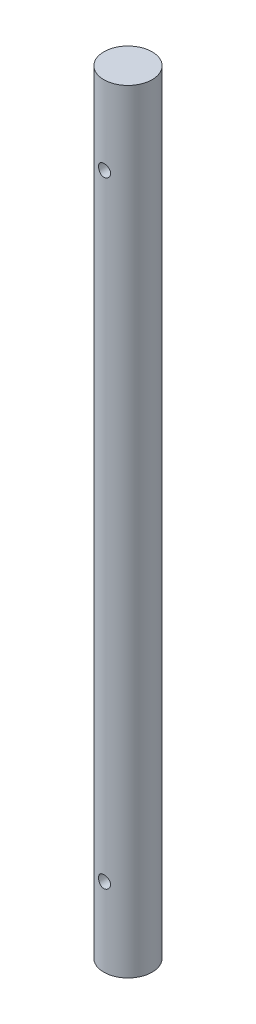
ISO-10303-21;
HEADER;
FILE_DESCRIPTION(('STEP AP214'),'2;1');
FILE_NAME('part.step','',(''),(''),'','','');
FILE_SCHEMA(('AUTOMOTIVE_DESIGN { 1 0 10303 214 1 1 1 1 }'));
ENDSEC;
DATA;
#1=APPLICATION_CONTEXT('core data for automotive mechanical design processes');
#2=APPLICATION_PROTOCOL_DEFINITION('international standard','automotive_design',2000,#1);
#3=PRODUCT_CONTEXT('',#1,'mechanical');
#4=PRODUCT('Part','Part','',(#3));
#5=PRODUCT_RELATED_PRODUCT_CATEGORY('part','',(#4));
#6=PRODUCT_DEFINITION_FORMATION('','',#4);
#7=PRODUCT_DEFINITION_CONTEXT('part definition',#1,'design');
#8=PRODUCT_DEFINITION('design','',#6,#7);
#9=PRODUCT_DEFINITION_SHAPE('','',#8);
#10=(LENGTH_UNIT() NAMED_UNIT(*) SI_UNIT(.MILLI.,.METRE.));
#11=(NAMED_UNIT(*) PLANE_ANGLE_UNIT() SI_UNIT($,.RADIAN.));
#12=(NAMED_UNIT(*) SI_UNIT($,.STERADIAN.) SOLID_ANGLE_UNIT());
#13=UNCERTAINTY_MEASURE_WITH_UNIT(LENGTH_MEASURE(1.E-05),#10,'distance_accuracy_value','');
#14=(GEOMETRIC_REPRESENTATION_CONTEXT(3) GLOBAL_UNCERTAINTY_ASSIGNED_CONTEXT((#13)) GLOBAL_UNIT_ASSIGNED_CONTEXT((#10,
#11,#12)) REPRESENTATION_CONTEXT('',''));
#15=CARTESIAN_POINT('',(0.,0.,0.));
#16=DIRECTION('',(0.,0.,1.));
#17=DIRECTION('',(1.,0.,0.));
#18=AXIS2_PLACEMENT_3D('',#15,#16,#17);
#19=CARTESIAN_POINT('',(0.,203.2,0.));
#20=DIRECTION('',(0.,-1.,0.));
#21=DIRECTION('',(0.,0.,-1.));
#22=AXIS2_PLACEMENT_3D('',#19,#20,#21);
#23=CYLINDRICAL_SURFACE('',#22,6.35);
#24=CARTESIAN_POINT('',(0.,184.15,-6.35));
#25=CARTESIAN_POINT('',(-0.0877105271754633,184.149997538594,-6.34999851693647));
#26=CARTESIAN_POINT('',(-0.175448550370886,184.142706442098,-6.34816461856185));
#27=CARTESIAN_POINT('',(-0.348410025990475,184.113778381533,-6.34102653803303));
#28=CARTESIAN_POINT('',(-0.433632024604862,184.092133286572,-6.335720389028));
#29=CARTESIAN_POINT('',(-0.599038756393224,184.035235123419,-6.32222537868075));
#30=CARTESIAN_POINT('',(-0.679229404630081,183.99999839636,-6.31403998007875));
#31=CARTESIAN_POINT('',(-0.832561339598846,183.916974695536,-6.29565822196369));
#32=CARTESIAN_POINT('',(-0.905702388435768,183.869187298441,-6.28546179462203));
#33=CARTESIAN_POINT('',(-1.04436537306014,183.761379164283,-6.2639301271799));
#34=CARTESIAN_POINT('',(-1.10972143864796,183.701148583168,-6.25257731732197));
#35=CARTESIAN_POINT('',(-1.22951761462348,183.570613083138,-6.23012914624386));
#36=CARTESIAN_POINT('',(-1.28395649243782,183.500307028215,-6.21903381421835));
#37=CARTESIAN_POINT('',(-1.38115309112897,183.350328385036,-6.1981797094886));
#38=CARTESIAN_POINT('',(-1.42372526185433,183.270532164059,-6.18844324148057));
#39=CARTESIAN_POINT('',(-1.49478672821597,183.104632930995,-6.1716654867627));
#40=CARTESIAN_POINT('',(-1.52327827533995,183.01853092973,-6.16462376920368));
#41=CARTESIAN_POINT('',(-1.5648038689512,182.844288131069,-6.15421337859408));
#42=CARTESIAN_POINT('',(-1.57813615065278,182.756222735014,-6.15077394721492));
#43=CARTESIAN_POINT('',(-1.58989371194681,182.57904326446,-6.14774575352442));
#44=CARTESIAN_POINT('',(-1.58832141675736,182.489929362927,-6.14815636474815));
#45=CARTESIAN_POINT('',(-1.57055240524324,182.315468270137,-6.15271825817254));
#46=CARTESIAN_POINT('',(-1.55471107670163,182.230082133949,-6.15677863343656));
#47=CARTESIAN_POINT('',(-1.50942059780578,182.063219554452,-6.16803767740945));
#48=CARTESIAN_POINT('',(-1.47997047802347,181.981743390128,-6.17523656968987));
#49=CARTESIAN_POINT('',(-1.40799553081682,181.824060599467,-6.19204495548597));
#50=CARTESIAN_POINT('',(-1.3653417228215,181.747915468189,-6.20167804905137));
#51=CARTESIAN_POINT('',(-1.26826039211583,181.603736032174,-6.22225610645758));
#52=CARTESIAN_POINT('',(-1.21383080915603,181.535703149962,-6.23320129970928));
#53=CARTESIAN_POINT('',(-1.09290212445429,181.407642840057,-6.25555306904601));
#54=CARTESIAN_POINT('',(-1.02610312322554,181.347898998018,-6.2669639019752));
#55=CARTESIAN_POINT('',(-0.883297612691412,181.240407518392,-6.28867980237548));
#56=CARTESIAN_POINT('',(-0.807290822240903,181.192660247238,-6.29898483606465));
#57=CARTESIAN_POINT('',(-0.647822648854469,181.110413129579,-6.3173793313301));
#58=CARTESIAN_POINT('',(-0.564336557812458,181.075959348231,-6.32546106135176));
#59=CARTESIAN_POINT('',(-0.392510441951223,181.021654184791,-6.33844212149251));
#60=CARTESIAN_POINT('',(-0.304171349100941,181.001800009457,-6.34334206034072));
#61=CARTESIAN_POINT('',(-0.127571468662793,180.977690743117,-6.34931736728871));
#62=CARTESIAN_POINT('',(-0.0393665286542016,180.97304946407,-6.35048739962928));
#63=CARTESIAN_POINT('',(0.136559792498252,180.978438527175,-6.34914068428627));
#64=CARTESIAN_POINT('',(0.224281216457186,180.988467548629,-6.34662426847621));
#65=CARTESIAN_POINT('',(0.395408434455112,181.022594211381,-6.33824806693119));
#66=CARTESIAN_POINT('',(0.478858917575257,181.046481170513,-6.3324383784665));
#67=CARTESIAN_POINT('',(0.640563967845568,181.107404997263,-6.31813047854459));
#68=CARTESIAN_POINT('',(0.718818009309532,181.144443192898,-6.30963199558136));
#69=CARTESIAN_POINT('',(0.869445317271586,181.231366569726,-6.29066250888679));
#70=CARTESIAN_POINT('',(0.941689592609587,181.281468052287,-6.28015917963337));
#71=CARTESIAN_POINT('',(1.07688233277243,181.392819320143,-6.25839605556685));
#72=CARTESIAN_POINT('',(1.1398291899131,181.454071029428,-6.24713613041388));
#73=CARTESIAN_POINT('',(1.25623168454363,181.587777075227,-6.22478812783483));
#74=CARTESIAN_POINT('',(1.30941642656664,181.660469485678,-6.21371105264873));
#75=CARTESIAN_POINT('',(1.4028322199551,181.813975371476,-6.19329129615911));
#76=CARTESIAN_POINT('',(1.44306384631714,181.894788486132,-6.18394853787602));
#77=CARTESIAN_POINT('',(1.50913192014483,182.06180855622,-6.1681581692752));
#78=CARTESIAN_POINT('',(1.53505365312555,182.147980073331,-6.16169345183934));
#79=CARTESIAN_POINT('',(1.57199082345108,182.323644366766,-6.15237470828778));
#80=CARTESIAN_POINT('',(1.58300952074824,182.413136412343,-6.14951989253599));
#81=CARTESIAN_POINT('',(1.58965750810348,182.590144750247,-6.14780437107521));
#82=CARTESIAN_POINT('',(1.58571977515062,182.677643952174,-6.14883128804079));
#83=CARTESIAN_POINT('',(1.56355761954778,182.850688282174,-6.15450370366634));
#84=CARTESIAN_POINT('',(1.54533348401016,182.936233449481,-6.15914912960548));
#85=CARTESIAN_POINT('',(1.49535231307696,183.102470619178,-6.17147250889215));
#86=CARTESIAN_POINT('',(1.46367648662006,183.183188481379,-6.17913224458427));
#87=CARTESIAN_POINT('',(1.3877553668987,183.338221696705,-6.19662374808777));
#88=CARTESIAN_POINT('',(1.34350833028618,183.412536159956,-6.20645581711151));
#89=CARTESIAN_POINT('',(1.24234336730764,183.554745315694,-6.22750462928884));
#90=CARTESIAN_POINT('',(1.18512501408213,183.622421969374,-6.23875080280276));
#91=CARTESIAN_POINT('',(1.06022708450913,183.747353955742,-6.26118495502319));
#92=CARTESIAN_POINT('',(0.992545027501373,183.804606810203,-6.27237291927805));
#93=CARTESIAN_POINT('',(0.847161529260239,183.908076968231,-6.29367185560443));
#94=CARTESIAN_POINT('',(0.769300830284842,183.954075632802,-6.3037596531221));
#95=CARTESIAN_POINT('',(0.606706579648587,184.032257731612,-6.32147712265334));
#96=CARTESIAN_POINT('',(0.521978004637215,184.06445106502,-6.32910855503102));
#97=CARTESIAN_POINT('',(0.364500851349342,184.109330187099,-6.33992529706865));
#98=CARTESIAN_POINT('',(0.292502347544375,184.124548398898,-6.34367735847431));
#99=CARTESIAN_POINT('',(0.147008925709235,184.144883957,-6.34871523870479));
#100=CARTESIAN_POINT('',(0.0735141206484363,184.150002063015,-6.35000124302196));
#101=CARTESIAN_POINT('',(0.,184.15,-6.35));
#102=B_SPLINE_CURVE_WITH_KNOTS('',3,(#24,#25,#26,#27,#28,#29,#30,#31,#32,#33,#34,#35,#36,#37,
#38,#39,#40,#41,#42,#43,#44,#45,#46,#47,#48,#49,#50,#51,#52,#53,#54,#55,#56,#57,#58,#59,#60,#61,
#62,#63,#64,#65,#66,#67,#68,#69,#70,#71,#72,#73,#74,#75,#76,#77,#78,#79,#80,#81,#82,#83,#84,#85,
#86,#87,#88,#89,#90,#91,#92,#93,#94,#95,#96,#97,#98,#99,#100,#101),.UNSPECIFIED.,.T.,.F.,(4,2,2,
2,2,2,2,2,2,2,2,2,2,2,2,2,2,2,2,2,2,2,2,2,2,2,2,2,2,2,2,2,2,2,2,2,2,2,4),(0.,0.262862179032743,
0.525873384966787,0.788569354919456,1.0512741866792,1.31883610837638,1.58642822138897,
1.85799568652644,2.12951971404246,2.39560412313564,2.66164523669271,2.92123809332429,
3.18084944501558,3.44308141999853,3.70535931134937,3.97511588525547,4.24488069782479,
4.51557209034645,4.78621167987146,5.04992543637983,5.31361545344319,5.57339790527356,
5.83320659749424,6.09762546839999,6.36209000850152,6.63304605574736,6.90399007343227,
7.17330136133187,7.44255372942131,7.7040716758853,7.96558436678469,8.22554023925414,
8.48553217944886,8.75230635033822,9.01914386340358,9.29081396320397,9.56228893377594,
9.78262207113774,10.0029386347888),.UNSPECIFIED.);
#103=CARTESIAN_POINT('',(0.,184.15,-6.35));
#104=VERTEX_POINT('',#103);
#105=EDGE_CURVE('E10',#104,#104,#102,.T.);
#106=ORIENTED_EDGE('',*,*,#105,.T.);
#107=EDGE_LOOP('',(#106));
#108=FACE_BOUND('',#107,.T.);
#109=CARTESIAN_POINT('',(1.5875,182.5625,6.14836106210428));
#110=CARTESIAN_POINT('',(1.58749750990578,182.474837773163,6.14836273554171));
#111=CARTESIAN_POINT('',(1.58021416589079,182.387147989339,6.15025634318835));
#112=CARTESIAN_POINT('',(1.55131968466973,182.214286587859,6.15760682365713));
#113=CARTESIAN_POINT('',(1.5297002087813,182.129116465913,6.16306577024851));
#114=CARTESIAN_POINT('',(1.47287691176629,181.963819753251,6.17689090118439));
#115=CARTESIAN_POINT('',(1.43769062718759,181.88368680633,6.18525333108409));
#116=CARTESIAN_POINT('',(1.354785924701,181.730452608637,6.20393851938293));
#117=CARTESIAN_POINT('',(1.30706697473604,181.657351656579,6.21426136100349));
#118=CARTESIAN_POINT('',(1.19932985134304,181.518647855259,6.23595854885813));
#119=CARTESIAN_POINT('',(1.13908642369208,181.453222563778,6.24734969490624));
#120=CARTESIAN_POINT('',(1.00849561070393,181.333291514581,6.26975425952214));
#121=CARTESIAN_POINT('',(0.93814728180451,181.27878677773,6.28076764269657));
#122=CARTESIAN_POINT('',(0.788127202685154,181.181517578054,6.30136163855569));
#123=CARTESIAN_POINT('',(0.708339055883918,181.138927543517,6.31092011499376));
#124=CARTESIAN_POINT('',(0.542457122025918,181.067830875963,6.32733565573));
#125=CARTESIAN_POINT('',(0.456364267477895,181.039322165034,6.33419311857309));
#126=CARTESIAN_POINT('',(0.282167811808904,180.997766125043,6.34431521868594));
#127=CARTESIAN_POINT('',(0.194140276913612,180.984417275853,6.34764982591139));
#128=CARTESIAN_POINT('',(0.0170363002318725,180.97261342916,6.35059432258134));
#129=CARTESIAN_POINT('',(-0.0720399845316582,180.974156229647,6.35020476271407));
#130=CARTESIAN_POINT('',(-0.246621692386148,180.991875029909,6.34579690295495));
#131=CARTESIAN_POINT('',(-0.332162492266677,181.007725566409,6.34185931486455));
#132=CARTESIAN_POINT('',(-0.49932946776921,181.053086756481,6.33089181193282));
#133=CARTESIAN_POINT('',(-0.580955434750553,181.082598137215,6.3238617324801));
#134=CARTESIAN_POINT('',(-0.738833141809102,181.154706632386,6.30737568660069));
#135=CARTESIAN_POINT('',(-0.815029659254312,181.19741957336,6.29789837506359));
#136=CARTESIAN_POINT('',(-0.959287550465513,181.294630856239,6.27754588919127));
#137=CARTESIAN_POINT('',(-1.02734750569823,181.349131248536,6.26667047179331));
#138=CARTESIAN_POINT('',(-1.15534128069735,181.470115051159,6.24435958243646));
#139=CARTESIAN_POINT('',(-1.21500531553186,181.536882856641,6.23291691898958));
#140=CARTESIAN_POINT('',(-1.32234999684127,181.679595983198,6.21103052633109));
#141=CARTESIAN_POINT('',(-1.37003008322304,181.755541732977,6.20058684382292));
#142=CARTESIAN_POINT('',(-1.45222615482336,181.914984171685,6.18185515488097));
#143=CARTESIAN_POINT('',(-1.48667718756565,181.998515688749,6.17357784665833));
#144=CARTESIAN_POINT('',(-1.54096342276019,182.170441772229,6.16025336488873));
#145=CARTESIAN_POINT('',(-1.56080175290274,182.258835293629,6.15520550014489));
#146=CARTESIAN_POINT('',(-1.58485182055238,182.435474283467,6.14905651084854));
#147=CARTESIAN_POINT('',(-1.58946245093896,182.523661998764,6.14785466574467));
#148=CARTESIAN_POINT('',(-1.58401828897737,182.699546929727,6.1492596311046));
#149=CARTESIAN_POINT('',(-1.57396484663399,182.787244189799,6.15186609096804));
#150=CARTESIAN_POINT('',(-1.53982766960041,182.958177558246,6.16049747041146));
#151=CARTESIAN_POINT('',(-1.5159761833589,183.041463181372,6.16646576098828));
#152=CARTESIAN_POINT('',(-1.45517748186084,183.202853975736,6.18109456102061));
#153=CARTESIAN_POINT('',(-1.41822871529746,183.280958532,6.1897553893787));
#154=CARTESIAN_POINT('',(-1.33144937413971,183.431460211446,6.20900547054222));
#155=CARTESIAN_POINT('',(-1.28138031368563,183.503715313427,6.21962922065217));
#156=CARTESIAN_POINT('',(-1.17008321503346,183.638944610379,6.24152347750539));
#157=CARTESIAN_POINT('',(-1.10885334300365,183.701917277073,6.25279409032578));
#158=CARTESIAN_POINT('',(-0.975142069563265,183.818410012033,6.2750535092507));
#159=CARTESIAN_POINT('',(-0.902417474643916,183.871654139718,6.28602820809266));
#160=CARTESIAN_POINT('',(-0.748828008777813,183.965174275514,6.30616732549721));
#161=CARTESIAN_POINT('',(-0.667963562720194,184.005450960046,6.31533183847515));
#162=CARTESIAN_POINT('',(-0.500948645248125,184.071543231925,6.33076023493829));
#163=CARTESIAN_POINT('',(-0.414841342381778,184.097462820581,6.3370449206423));
#164=CARTESIAN_POINT('',(-0.239315244506121,184.134417312476,6.34609661306325));
#165=CARTESIAN_POINT('',(-0.149897092002988,184.145455088299,6.34886429864814));
#166=CARTESIAN_POINT('',(0.0271200982287676,184.152171048451,6.35054243936488));
#167=CARTESIAN_POINT('',(0.114702950308564,184.148256463189,6.34955516472013));
#168=CARTESIAN_POINT('',(0.287920900558385,184.12611157417,6.3440611062616));
#169=CARTESIAN_POINT('',(0.373556056577142,184.107881696167,6.33955442711888));
#170=CARTESIAN_POINT('',(0.540021519086132,184.057842101114,6.32754374655666));
#171=CARTESIAN_POINT('',(0.620875210147356,184.026106017863,6.32005601147983));
#172=CARTESIAN_POINT('',(0.776155821703319,183.950021705807,6.30287171149998));
#173=CARTESIAN_POINT('',(0.850581930508256,183.905671887137,6.29317486818656));
#174=CARTESIAN_POINT('',(0.99282556137293,183.80437706603,6.27232758869116));
#175=CARTESIAN_POINT('',(1.06044204392717,183.747155773135,6.26114789401158));
#176=CARTESIAN_POINT('',(1.18525134468061,183.622278722492,6.23872655372022));
#177=CARTESIAN_POINT('',(1.24244151604574,183.554620323195,6.22748489312182));
#178=CARTESIAN_POINT('',(1.34582221703576,183.409270254955,6.2059736792862));
#179=CARTESIAN_POINT('',(1.39178763337138,183.331414954082,6.19572617421192));
#180=CARTESIAN_POINT('',(1.46990894837736,183.168836909748,6.17766029436603));
#181=CARTESIAN_POINT('',(1.50207489424355,183.084119216306,6.16984015341641));
#182=CARTESIAN_POINT('',(1.54689576409763,182.926708993725,6.15873655124406));
#183=CARTESIAN_POINT('',(1.56208915832016,182.854769601541,6.15487502513368));
#184=CARTESIAN_POINT('',(1.58239188946006,182.709393170463,6.14968668754596));
#185=CARTESIAN_POINT('',(1.58750208656584,182.635956259861,6.14835965985316));
#186=CARTESIAN_POINT('',(1.5875,182.5625,6.14836106210428));
#187=B_SPLINE_CURVE_WITH_KNOTS('',3,(#109,#110,#111,#112,#113,#114,#115,#116,#117,#118,#119,
#120,#121,#122,#123,#124,#125,#126,#127,#128,#129,#130,#131,#132,#133,#134,#135,#136,#137,#138,
#139,#140,#141,#142,#143,#144,#145,#146,#147,#148,#149,#150,#151,#152,#153,#154,#155,#156,#157,
#158,#159,#160,#161,#162,#163,#164,#165,#166,#167,#168,#169,#170,#171,#172,#173,#174,#175,#176,
#177,#178,#179,#180,#181,#182,#183,#184,#185,#186),.UNSPECIFIED.,.T.,.F.,(4,2,2,2,2,2,2,2,2,2,2,
2,2,2,2,2,2,2,2,2,2,2,2,2,2,2,2,2,2,2,2,2,2,2,2,2,2,2,4),(0.,0.262716925502425,
0.525586795807191,0.788118011750419,1.05066037489727,1.31841210912538,1.58618886139712,
1.85770200212677,2.12917506502903,2.39514856882044,2.66108274402921,2.9211159680748,
3.18116303520237,3.4435597515157,3.70600214772757,3.9755474627316,4.24510537311872,
4.51597034325334,4.7867773208226,5.05043169973685,5.31406180761716,5.57337852180849,
5.832725961026,6.09716107120564,6.36163966992002,6.63273585162975,6.90381788981914,
7.17290966232398,7.44194948557238,7.70371488290933,7.96547249534381,8.22582096615415,
8.48620226643675,8.75282156329614,9.01950845044096,9.29117063075766,9.562634680678,
9.78279620257601,10.0029389418819),.UNSPECIFIED.);
#188=CARTESIAN_POINT('',(1.5875,182.5625,6.14836106210428));
#189=VERTEX_POINT('',#188);
#190=EDGE_CURVE('E48',#189,#189,#187,.T.);
#191=ORIENTED_EDGE('',*,*,#190,.T.);
#192=EDGE_LOOP('',(#191));
#193=FACE_BOUND('',#192,.T.);
#194=CARTESIAN_POINT('',(0.,22.225,-6.35));
#195=CARTESIAN_POINT('',(-0.0877105271754652,22.2249975385938,-6.34999851693647));
#196=CARTESIAN_POINT('',(-0.175448550370891,22.2177064420977,-6.34816461856185));
#197=CARTESIAN_POINT('',(-0.34841002599048,22.1887783815334,-6.34102653803302));
#198=CARTESIAN_POINT('',(-0.433632024604865,22.1671332865724,-6.335720389028));
#199=CARTESIAN_POINT('',(-0.599038756393226,22.1102351234193,-6.32222537868075));
#200=CARTESIAN_POINT('',(-0.679229404630085,22.0749983963597,-6.31403998007875));
#201=CARTESIAN_POINT('',(-0.83256133959885,21.9919746955359,-6.29565822196369));
#202=CARTESIAN_POINT('',(-0.905702388435769,21.9441872984408,-6.28546179462203));
#203=CARTESIAN_POINT('',(-1.04436537306014,21.8363791642826,-6.2639301271799));
#204=CARTESIAN_POINT('',(-1.10972143864797,21.7761485831682,-6.25257731732197));
#205=CARTESIAN_POINT('',(-1.22951761462349,21.6456130831381,-6.23012914624385));
#206=CARTESIAN_POINT('',(-1.28395649243783,21.575307028215,-6.21903381421835));
#207=CARTESIAN_POINT('',(-1.38115309112898,21.4253283850362,-6.1981797094886));
#208=CARTESIAN_POINT('',(-1.42372526185433,21.345532164059,-6.18844324148057));
#209=CARTESIAN_POINT('',(-1.49478672821597,21.1796329309949,-6.17166548676269));
#210=CARTESIAN_POINT('',(-1.52327827533996,21.0935309297302,-6.16462376920368));
#211=CARTESIAN_POINT('',(-1.56480386895121,20.919288131069,-6.15421337859408));
#212=CARTESIAN_POINT('',(-1.57813615065278,20.831222735014,-6.15077394721492));
#213=CARTESIAN_POINT('',(-1.58989371194681,20.6540432644602,-6.14774575352442));
#214=CARTESIAN_POINT('',(-1.58832141675736,20.5649293629273,-6.14815636474815));
#215=CARTESIAN_POINT('',(-1.57055240524324,20.3904682701371,-6.15271825817254));
#216=CARTESIAN_POINT('',(-1.55471107670163,20.3050821339494,-6.15677863343656));
#217=CARTESIAN_POINT('',(-1.50942059780579,20.1382195544522,-6.16803767740945));
#218=CARTESIAN_POINT('',(-1.47997047802347,20.0567433901277,-6.17523656968987));
#219=CARTESIAN_POINT('',(-1.40799553081682,19.8990605994666,-6.19204495548597));
#220=CARTESIAN_POINT('',(-1.3653417228215,19.8229154681894,-6.20167804905137));
#221=CARTESIAN_POINT('',(-1.26826039211583,19.678736032174,-6.22225610645758));
#222=CARTESIAN_POINT('',(-1.21383080915602,19.6107031499622,-6.23320129970928));
#223=CARTESIAN_POINT('',(-1.09290212445429,19.4826428400568,-6.25555306904602));
#224=CARTESIAN_POINT('',(-1.02610312322554,19.4228989980184,-6.2669639019752));
#225=CARTESIAN_POINT('',(-0.883297612691415,19.3154075183924,-6.28867980237548));
#226=CARTESIAN_POINT('',(-0.807290822240907,19.2676602472377,-6.29898483606464));
#227=CARTESIAN_POINT('',(-0.647822648854472,19.1854131295792,-6.3173793313301));
#228=CARTESIAN_POINT('',(-0.564336557812459,19.1509593482307,-6.32546106135176));
#229=CARTESIAN_POINT('',(-0.392510441951218,19.0966541847907,-6.33844212149251));
#230=CARTESIAN_POINT('',(-0.30417134910093,19.0768000094575,-6.34334206034072));
#231=CARTESIAN_POINT('',(-0.127571468662779,19.0526907431169,-6.34931736728871));
#232=CARTESIAN_POINT('',(-0.0393665286541897,19.0480494640703,-6.35048739962928));
#233=CARTESIAN_POINT('',(0.136559792498262,19.0534385271754,-6.34914068428627));
#234=CARTESIAN_POINT('',(0.224281216457195,19.0634675486291,-6.34662426847621));
#235=CARTESIAN_POINT('',(0.39540843445512,19.0975942113809,-6.33824806693119));
#236=CARTESIAN_POINT('',(0.478858917575265,19.1214811705132,-6.3324383784665));
#237=CARTESIAN_POINT('',(0.640563967845574,19.1824049972634,-6.31813047854458));
#238=CARTESIAN_POINT('',(0.718818009309537,19.2194431928981,-6.30963199558136));
#239=CARTESIAN_POINT('',(0.869445317271587,19.3063665697258,-6.29066250888678));
#240=CARTESIAN_POINT('',(0.941689592609587,19.3564680522866,-6.28015917963336));
#241=CARTESIAN_POINT('',(1.07688233277243,19.4678193201435,-6.25839605556685));
#242=CARTESIAN_POINT('',(1.1398291899131,19.5290710294279,-6.24713613041388));
#243=CARTESIAN_POINT('',(1.25623168454364,19.6627770752271,-6.22478812783483));
#244=CARTESIAN_POINT('',(1.30941642656665,19.7354694856776,-6.21371105264873));
#245=CARTESIAN_POINT('',(1.4028322199551,19.8889753714762,-6.19329129615911));
#246=CARTESIAN_POINT('',(1.44306384631715,19.9697884861324,-6.18394853787602));
#247=CARTESIAN_POINT('',(1.50913192014483,20.1368085562205,-6.1681581692752));
#248=CARTESIAN_POINT('',(1.53505365312555,20.2229800733307,-6.16169345183933));
#249=CARTESIAN_POINT('',(1.57199082345108,20.398644366766,-6.15237470828778));
#250=CARTESIAN_POINT('',(1.58300952074824,20.4881364123427,-6.14951989253599));
#251=CARTESIAN_POINT('',(1.58965750810348,20.6651447502468,-6.14780437107521));
#252=CARTESIAN_POINT('',(1.58571977515062,20.7526439521737,-6.14883128804079));
#253=CARTESIAN_POINT('',(1.56355761954778,20.9256882821736,-6.15450370366634));
#254=CARTESIAN_POINT('',(1.54533348401016,21.0112334494811,-6.15914912960548));
#255=CARTESIAN_POINT('',(1.49535231307696,21.1774706191776,-6.17147250889214));
#256=CARTESIAN_POINT('',(1.46367648662006,21.2581884813792,-6.17913224458427));
#257=CARTESIAN_POINT('',(1.3877553668987,21.4132216967053,-6.19662374808777));
#258=CARTESIAN_POINT('',(1.34350833028618,21.4875361599562,-6.20645581711151));
#259=CARTESIAN_POINT('',(1.24234336730763,21.6297453156938,-6.22750462928884));
#260=CARTESIAN_POINT('',(1.18512501408214,21.6974219693737,-6.23875080280276));
#261=CARTESIAN_POINT('',(1.06022708450914,21.8223539557418,-6.26118495502319));
#262=CARTESIAN_POINT('',(0.99254502750138,21.8796068102029,-6.27237291927805));
#263=CARTESIAN_POINT('',(0.847161529260242,21.9830769682309,-6.29367185560443));
#264=CARTESIAN_POINT('',(0.769300830284844,22.0290756328024,-6.3037596531221));
#265=CARTESIAN_POINT('',(0.606706579648589,22.1072577316121,-6.32147712265334));
#266=CARTESIAN_POINT('',(0.521978004637218,22.1394510650197,-6.32910855503102));
#267=CARTESIAN_POINT('',(0.364500851349342,22.1843301870989,-6.33992529706865));
#268=CARTESIAN_POINT('',(0.292502347544374,22.1995483988982,-6.34367735847431));
#269=CARTESIAN_POINT('',(0.147008925709234,22.2198839569999,-6.34871523870479));
#270=CARTESIAN_POINT('',(0.073514120648436,22.2250020630148,-6.35000124302196));
#271=CARTESIAN_POINT('',(0.,22.225,-6.35));
#272=B_SPLINE_CURVE_WITH_KNOTS('',3,(#194,#195,#196,#197,#198,#199,#200,#201,#202,#203,#204,
#205,#206,#207,#208,#209,#210,#211,#212,#213,#214,#215,#216,#217,#218,#219,#220,#221,#222,#223,
#224,#225,#226,#227,#228,#229,#230,#231,#232,#233,#234,#235,#236,#237,#238,#239,#240,#241,#242,
#243,#244,#245,#246,#247,#248,#249,#250,#251,#252,#253,#254,#255,#256,#257,#258,#259,#260,#261,
#262,#263,#264,#265,#266,#267,#268,#269,#270,#271),.UNSPECIFIED.,.T.,.F.,(4,2,2,2,2,2,2,2,2,2,2,
2,2,2,2,2,2,2,2,2,2,2,2,2,2,2,2,2,2,2,2,2,2,2,2,2,2,2,4),(0.,0.262862179032749,
0.525873384966793,0.78856935491946,1.0512741866792,1.31883610837639,1.58642822138899,
1.85799568652645,2.12951971404248,2.39560412313564,2.66164523669271,2.92123809332427,
3.18084944501557,3.44308141999855,3.70535931134938,3.97511588525545,4.24488069782478,
4.51557209034645,4.78621167987146,5.04992543637984,5.31361545344319,5.57339790527356,
5.83320659749424,6.09762546839997,6.36209000850153,6.63304605574736,6.90399007343229,
7.17330136133188,7.44255372942131,7.70407167588531,7.96558436678469,8.22554023925414,
8.48553217944887,8.75230635033821,9.01914386340358,9.29081396320396,9.56228893377594,
9.78262207113773,10.0029386347888),.UNSPECIFIED.);
#273=CARTESIAN_POINT('',(0.,22.225,-6.35));
#274=VERTEX_POINT('',#273);
#275=EDGE_CURVE('E55',#274,#274,#272,.T.);
#276=ORIENTED_EDGE('',*,*,#275,.T.);
#277=EDGE_LOOP('',(#276));
#278=FACE_BOUND('',#277,.T.);
#279=CARTESIAN_POINT('',(1.5875,20.6375,6.14836106210428));
#280=CARTESIAN_POINT('',(1.58749750990578,20.5498377731629,6.14836273554171));
#281=CARTESIAN_POINT('',(1.58021416589079,20.4621479893395,6.15025634318835));
#282=CARTESIAN_POINT('',(1.55131968466973,20.2892865878595,6.15760682365713));
#283=CARTESIAN_POINT('',(1.52970020878129,20.2041164659126,6.16306577024851));
#284=CARTESIAN_POINT('',(1.47287691176629,20.0388197532512,6.17689090118439));
#285=CARTESIAN_POINT('',(1.43769062718759,19.9586868063301,6.18525333108409));
#286=CARTESIAN_POINT('',(1.35478592470099,19.8054526086372,6.20393851938293));
#287=CARTESIAN_POINT('',(1.30706697473604,19.7323516565791,6.21426136100349));
#288=CARTESIAN_POINT('',(1.19932985134304,19.5936478552585,6.23595854885813));
#289=CARTESIAN_POINT('',(1.13908642369207,19.5282225637777,6.24734969490624));
#290=CARTESIAN_POINT('',(1.00849561070392,19.4082915145812,6.26975425952214));
#291=CARTESIAN_POINT('',(0.938147281804495,19.3537867777302,6.28076764269657));
#292=CARTESIAN_POINT('',(0.788127202685136,19.2565175780541,6.30136163855569));
#293=CARTESIAN_POINT('',(0.708339055883901,19.2139275435175,6.31092011499376));
#294=CARTESIAN_POINT('',(0.542457122025904,19.1428308759628,6.32733565573));
#295=CARTESIAN_POINT('',(0.456364267477882,19.1143221650337,6.33419311857309));
#296=CARTESIAN_POINT('',(0.282167811808892,19.0727661250426,6.34431521868594));
#297=CARTESIAN_POINT('',(0.194140276913599,19.0594172758526,6.34764982591139));
#298=CARTESIAN_POINT('',(0.0170363002318586,19.04761342916,6.35059432258134));
#299=CARTESIAN_POINT('',(-0.0720399845316733,19.0491562296469,6.35020476271407));
#300=CARTESIAN_POINT('',(-0.246621692386165,19.0668750299088,6.34579690295494));
#301=CARTESIAN_POINT('',(-0.332162492266694,19.0827255664092,6.34185931486455));
#302=CARTESIAN_POINT('',(-0.499329467769227,19.1280867564808,6.33089181193282));
#303=CARTESIAN_POINT('',(-0.58095543475057,19.1575981372147,6.3238617324801));
#304=CARTESIAN_POINT('',(-0.738833141809117,19.2297066323863,6.30737568660069));
#305=CARTESIAN_POINT('',(-0.815029659254325,19.2724195733602,6.29789837506359));
#306=CARTESIAN_POINT('',(-0.959287550465526,19.3696308562388,6.27754588919127));
#307=CARTESIAN_POINT('',(-1.02734750569824,19.424131248536,6.26667047179331));
#308=CARTESIAN_POINT('',(-1.15534128069737,19.5451150511588,6.24435958243645));
#309=CARTESIAN_POINT('',(-1.21500531553188,19.6118828566408,6.23291691898958));
#310=CARTESIAN_POINT('',(-1.32234999684129,19.7545959831981,6.21103052633108));
#311=CARTESIAN_POINT('',(-1.37003008322305,19.8305417329768,6.20058684382291));
#312=CARTESIAN_POINT('',(-1.45222615482337,19.9899841716846,6.18185515488097));
#313=CARTESIAN_POINT('',(-1.48667718756565,20.0735156887489,6.17357784665833));
#314=CARTESIAN_POINT('',(-1.54096342276019,20.2454417722285,6.16025336488873));
#315=CARTESIAN_POINT('',(-1.56080175290274,20.3338352936293,6.15520550014489));
#316=CARTESIAN_POINT('',(-1.58485182055239,20.5104742834672,6.14905651084854));
#317=CARTESIAN_POINT('',(-1.58946245093896,20.5986619987643,6.14785466574466));
#318=CARTESIAN_POINT('',(-1.58401828897737,20.7745469297271,6.1492596311046));
#319=CARTESIAN_POINT('',(-1.57396484663399,20.862244189799,6.15186609096804));
#320=CARTESIAN_POINT('',(-1.53982766960041,21.0331775582462,6.16049747041146));
#321=CARTESIAN_POINT('',(-1.51597618335891,21.1164631813725,6.16646576098828));
#322=CARTESIAN_POINT('',(-1.45517748186084,21.2778539757358,6.18109456102061));
#323=CARTESIAN_POINT('',(-1.41822871529746,21.3559585320001,6.1897553893787));
#324=CARTESIAN_POINT('',(-1.33144937413971,21.5064602114458,6.20900547054222));
#325=CARTESIAN_POINT('',(-1.28138031368562,21.5787153134274,6.21962922065217));
#326=CARTESIAN_POINT('',(-1.17008321503345,21.7139446103789,6.2415234775054));
#327=CARTESIAN_POINT('',(-1.10885334300363,21.7769172770728,6.25279409032579));
#328=CARTESIAN_POINT('',(-0.975142069563251,21.8934100120326,6.2750535092507));
#329=CARTESIAN_POINT('',(-0.902417474643902,21.9466541397185,6.28602820809266));
#330=CARTESIAN_POINT('',(-0.748828008777796,22.040174275514,6.30616732549721));
#331=CARTESIAN_POINT('',(-0.667963562720175,22.0804509600462,6.31533183847515));
#332=CARTESIAN_POINT('',(-0.500948645248106,22.1465432319252,6.33076023493829));
#333=CARTESIAN_POINT('',(-0.414841342381761,22.1724628205807,6.3370449206423));
#334=CARTESIAN_POINT('',(-0.239315244506107,22.2094173124763,6.34609661306326));
#335=CARTESIAN_POINT('',(-0.149897092002974,22.2204550882993,6.34886429864815));
#336=CARTESIAN_POINT('',(0.0271200982287801,22.2271710484512,6.35054243936488));
#337=CARTESIAN_POINT('',(0.114702950308577,22.2232564631889,6.34955516472013));
#338=CARTESIAN_POINT('',(0.287920900558398,22.2011115741702,6.3440611062616));
#339=CARTESIAN_POINT('',(0.373556056577157,22.1828816961667,6.33955442711888));
#340=CARTESIAN_POINT('',(0.540021519086145,22.1328421011137,6.32754374655666));
#341=CARTESIAN_POINT('',(0.620875210147366,22.101106017863,6.32005601147982));
#342=CARTESIAN_POINT('',(0.776155821703329,22.0250217058068,6.30287171149997));
#343=CARTESIAN_POINT('',(0.850581930508268,21.9806718871371,6.29317486818656));
#344=CARTESIAN_POINT('',(0.992825561372939,21.8793770660296,6.27232758869116));
#345=CARTESIAN_POINT('',(1.06044204392718,21.8221557731345,6.26114789401158));
#346=CARTESIAN_POINT('',(1.18525134468062,21.6972787224916,6.23872655372022));
#347=CARTESIAN_POINT('',(1.24244151604575,21.6296203231946,6.22748489312182));
#348=CARTESIAN_POINT('',(1.34582221703577,21.4842702549554,6.2059736792862));
#349=CARTESIAN_POINT('',(1.3917876333714,21.4064149540825,6.19572617421192));
#350=CARTESIAN_POINT('',(1.46990894837737,21.2438369097477,6.17766029436602));
#351=CARTESIAN_POINT('',(1.50207489424355,21.1591192163056,6.16984015341641));
#352=CARTESIAN_POINT('',(1.54689576409763,21.0017089937251,6.15873655124406));
#353=CARTESIAN_POINT('',(1.56208915832016,20.9297696015406,6.15487502513368));
#354=CARTESIAN_POINT('',(1.58239188946006,20.7843931704626,6.14968668754596));
#355=CARTESIAN_POINT('',(1.58750208656584,20.710956259861,6.14835965985316));
#356=CARTESIAN_POINT('',(1.5875,20.6375,6.14836106210428));
#357=B_SPLINE_CURVE_WITH_KNOTS('',3,(#279,#280,#281,#282,#283,#284,#285,#286,#287,#288,#289,
#290,#291,#292,#293,#294,#295,#296,#297,#298,#299,#300,#301,#302,#303,#304,#305,#306,#307,#308,
#309,#310,#311,#312,#313,#314,#315,#316,#317,#318,#319,#320,#321,#322,#323,#324,#325,#326,#327,
#328,#329,#330,#331,#332,#333,#334,#335,#336,#337,#338,#339,#340,#341,#342,#343,#344,#345,#346,
#347,#348,#349,#350,#351,#352,#353,#354,#355,#356),.UNSPECIFIED.,.T.,.F.,(4,2,2,2,2,2,2,2,2,2,2,
2,2,2,2,2,2,2,2,2,2,2,2,2,2,2,2,2,2,2,2,2,2,2,2,2,2,2,4),(0.,0.262716925502447,
0.525586795807202,0.788118011750423,1.05066037489729,1.3184121091254,1.58618886139715,
1.85770200212679,2.12917506502904,2.39514856882045,2.66108274402923,2.92111596807481,
3.18116303520239,3.44355975151572,3.7060021477276,3.97554746273163,4.24510537311874,
4.51597034325335,4.78677732082263,5.05043169973691,5.31406180761714,5.57337852180846,
5.832725961026,6.09716107120565,6.36163966992003,6.63273585162977,6.90381788981916,
7.172909662324,7.44194948557239,7.70371488290934,7.96547249534382,8.22582096615416,
8.48620226643675,8.75282156329614,9.01950845044098,9.29117063075769,9.56263468067803,
9.78279620257604,10.002938941882),.UNSPECIFIED.);
#358=CARTESIAN_POINT('',(1.5875,20.6375,6.14836106210428));
#359=VERTEX_POINT('',#358);
#360=EDGE_CURVE('E57',#359,#359,#357,.T.);
#361=ORIENTED_EDGE('',*,*,#360,.T.);
#362=EDGE_LOOP('',(#361));
#363=FACE_BOUND('',#362,.T.);
#364=CARTESIAN_POINT('',(0.,203.2,0.));
#365=DIRECTION('',(0.,1.,0.));
#366=DIRECTION('',(0.,0.,1.));
#367=AXIS2_PLACEMENT_3D('',#364,#365,#366);
#368=CIRCLE('',#367,6.35);
#369=CARTESIAN_POINT('',(0.,203.2,6.35));
#370=VERTEX_POINT('',#369);
#371=EDGE_CURVE('E81',#370,#370,#368,.T.);
#372=ORIENTED_EDGE('',*,*,#371,.F.);
#373=EDGE_LOOP('',(#372));
#374=FACE_BOUND('',#373,.T.);
#375=CARTESIAN_POINT('',(0.,0.,0.));
#376=DIRECTION('',(0.,1.,0.));
#377=DIRECTION('',(0.,0.,1.));
#378=AXIS2_PLACEMENT_3D('',#375,#376,#377);
#379=CIRCLE('',#378,6.35);
#380=CARTESIAN_POINT('',(0.,0.,6.35));
#381=VERTEX_POINT('',#380);
#382=EDGE_CURVE('E83',#381,#381,#379,.T.);
#383=ORIENTED_EDGE('',*,*,#382,.T.);
#384=EDGE_LOOP('',(#383));
#385=FACE_BOUND('',#384,.T.);
#386=ADVANCED_FACE('F40',(#108,#193,#278,#363,#374,#385),#23,.T.);
#387=CARTESIAN_POINT('',(0.,203.2,0.));
#388=DIRECTION('',(0.,1.,0.));
#389=DIRECTION('',(0.,0.,1.));
#390=AXIS2_PLACEMENT_3D('',#387,#388,#389);
#391=PLANE('',#390);
#392=ORIENTED_EDGE('',*,*,#371,.T.);
#393=EDGE_LOOP('',(#392));
#394=FACE_BOUND('',#393,.T.);
#395=ADVANCED_FACE('F80',(#394),#391,.T.);
#396=CARTESIAN_POINT('',(0.,0.,0.));
#397=DIRECTION('',(0.,1.,0.));
#398=DIRECTION('',(0.,0.,1.));
#399=AXIS2_PLACEMENT_3D('',#396,#397,#398);
#400=PLANE('',#399);
#401=ORIENTED_EDGE('',*,*,#382,.F.);
#402=EDGE_LOOP('',(#401));
#403=FACE_BOUND('',#402,.T.);
#404=ADVANCED_FACE('F73',(#403),#400,.F.);
#405=CARTESIAN_POINT('',(0.,20.6375,-6.35));
#406=DIRECTION('',(0.,0.,1.));
#407=DIRECTION('',(1.,0.,0.));
#408=AXIS2_PLACEMENT_3D('',#405,#406,#407);
#409=CYLINDRICAL_SURFACE('',#408,1.5875);
#410=ORIENTED_EDGE('',*,*,#360,.F.);
#411=EDGE_LOOP('',(#410));
#412=FACE_BOUND('',#411,.T.);
#413=ORIENTED_EDGE('',*,*,#275,.F.);
#414=EDGE_LOOP('',(#413));
#415=FACE_BOUND('',#414,.T.);
#416=ADVANCED_FACE('F66',(#412,#415),#409,.F.);
#417=CARTESIAN_POINT('',(0.,182.5625,-6.35));
#418=DIRECTION('',(0.,0.,1.));
#419=DIRECTION('',(1.,0.,0.));
#420=AXIS2_PLACEMENT_3D('',#417,#418,#419);
#421=CYLINDRICAL_SURFACE('',#420,1.5875);
#422=ORIENTED_EDGE('',*,*,#190,.F.);
#423=EDGE_LOOP('',(#422));
#424=FACE_BOUND('',#423,.T.);
#425=ORIENTED_EDGE('',*,*,#105,.F.);
#426=EDGE_LOOP('',(#425));
#427=FACE_BOUND('',#426,.T.);
#428=ADVANCED_FACE('F67',(#424,#427),#421,.F.);
#429=CLOSED_SHELL('',(#386,#395,#404,#416,#428));
#430=MANIFOLD_SOLID_BREP('B2',#429);
#431=ADVANCED_BREP_SHAPE_REPRESENTATION('',(#18,#430),#14);
#432=SHAPE_DEFINITION_REPRESENTATION(#9,#431);
ENDSEC;
END-ISO-10303-21;
